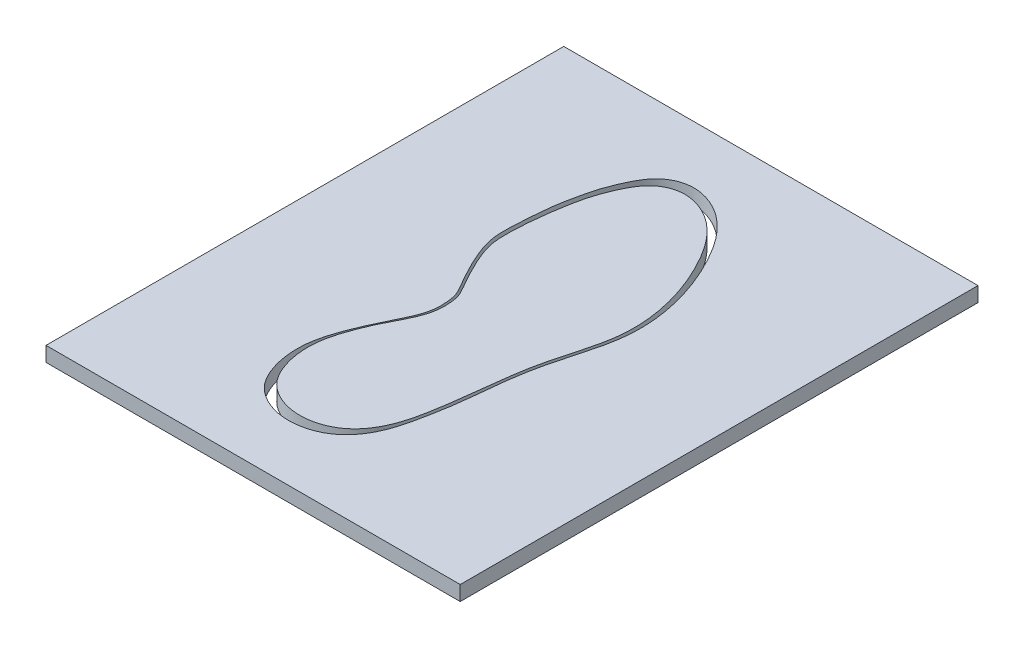
ISO-10303-21;
HEADER;
FILE_DESCRIPTION(('STEP AP214'),'2;1');
FILE_NAME('part.step','',(''),(''),'','','');
FILE_SCHEMA(('AUTOMOTIVE_DESIGN { 1 0 10303 214 1 1 1 1 }'));
ENDSEC;
DATA;
#1=APPLICATION_CONTEXT('core data for automotive mechanical design processes');
#2=APPLICATION_PROTOCOL_DEFINITION('international standard','automotive_design',2000,#1);
#3=PRODUCT_CONTEXT('',#1,'mechanical');
#4=PRODUCT('Part','Part','',(#3));
#5=PRODUCT_RELATED_PRODUCT_CATEGORY('part','',(#4));
#6=PRODUCT_DEFINITION_FORMATION('','',#4);
#7=PRODUCT_DEFINITION_CONTEXT('part definition',#1,'design');
#8=PRODUCT_DEFINITION('design','',#6,#7);
#9=PRODUCT_DEFINITION_SHAPE('','',#8);
#10=(LENGTH_UNIT() NAMED_UNIT(*) SI_UNIT(.MILLI.,.METRE.));
#11=(NAMED_UNIT(*) PLANE_ANGLE_UNIT() SI_UNIT($,.RADIAN.));
#12=(NAMED_UNIT(*) SI_UNIT($,.STERADIAN.) SOLID_ANGLE_UNIT());
#13=UNCERTAINTY_MEASURE_WITH_UNIT(LENGTH_MEASURE(1.E-05),#10,'distance_accuracy_value','');
#14=(GEOMETRIC_REPRESENTATION_CONTEXT(3) GLOBAL_UNCERTAINTY_ASSIGNED_CONTEXT((#13)) GLOBAL_UNIT_ASSIGNED_CONTEXT((#10,
#11,#12)) REPRESENTATION_CONTEXT('',''));
#15=CARTESIAN_POINT('',(0.,0.,0.));
#16=DIRECTION('',(0.,0.,1.));
#17=DIRECTION('',(1.,0.,0.));
#18=AXIS2_PLACEMENT_3D('',#15,#16,#17);
#19=CARTESIAN_POINT('',(39.071515045179,0.,-289.191713460955));
#20=CARTESIAN_POINT('',(36.7843321443078,0.,-289.043204994024));
#21=CARTESIAN_POINT('',(31.5349066885289,0.,-287.960394858502));
#22=CARTESIAN_POINT('',(24.0719898161011,0.,-283.508731667395));
#23=CARTESIAN_POINT('',(18.4391468612145,0.,-275.90311231066));
#24=CARTESIAN_POINT('',(13.8504328647284,0.,-266.260251260592));
#25=CARTESIAN_POINT('',(10.1872371657223,0.,-256.271347726682));
#26=CARTESIAN_POINT('',(6.90049589056789,0.,-241.474251783892));
#27=CARTESIAN_POINT('',(4.56900958336375,0.,-224.671633647286));
#28=CARTESIAN_POINT('',(3.42861613578065,0.,-208.175997234339));
#29=CARTESIAN_POINT('',(3.97866441496524,0.,-194.016708582578));
#30=CARTESIAN_POINT('',(9.64205838719882,0.,-178.657772381598));
#31=CARTESIAN_POINT('',(17.2469412435568,0.,-164.84194166683));
#32=CARTESIAN_POINT('',(23.6229019171972,0.,-154.038454970145));
#33=CARTESIAN_POINT('',(25.1235625136186,0.,-146.018566395798));
#34=CARTESIAN_POINT('',(25.009927703054,0.,-131.157514658181));
#35=CARTESIAN_POINT('',(14.6073943883956,0.,-114.232181052742));
#36=CARTESIAN_POINT('',(7.08436673653161,0.,-95.9110439805253));
#37=CARTESIAN_POINT('',(3.13024872423999,0.,-82.1231603648557));
#38=CARTESIAN_POINT('',(2.35479289544686,0.,-69.2444249654184));
#39=CARTESIAN_POINT('',(4.43721722500527,0.,-55.6607702504065));
#40=CARTESIAN_POINT('',(12.2838220761547,0.,-38.5155315548548));
#41=CARTESIAN_POINT('',(34.6662568830087,0.,-26.5559346371254));
#42=CARTESIAN_POINT('',(60.2142297148544,0.,-32.1959006756966));
#43=CARTESIAN_POINT('',(76.6316011839039,0.,-52.163311317483));
#44=CARTESIAN_POINT('',(83.3109457842583,0.,-80.8796227575248));
#45=CARTESIAN_POINT('',(86.2039403370988,0.,-111.444244557665));
#46=CARTESIAN_POINT('',(90.3178506663487,0.,-139.623714684678));
#47=CARTESIAN_POINT('',(96.5873098246737,0.,-161.627157242931));
#48=CARTESIAN_POINT('',(102.257255545625,0.,-183.725585081417));
#49=CARTESIAN_POINT('',(101.601282412399,0.,-206.397808239554));
#50=CARTESIAN_POINT('',(96.2803690372181,0.,-229.960784387677));
#51=CARTESIAN_POINT('',(86.1348331378277,0.,-253.326091062377));
#52=CARTESIAN_POINT('',(72.4897383753447,0.,-274.211185251201));
#53=CARTESIAN_POINT('',(56.1641016601698,0.,-286.501072373214));
#54=CARTESIAN_POINT('',(44.4282953642183,0.,-289.539533144535));
#55=CARTESIAN_POINT('',(39.071515045179,0.,-289.191713460955));
#56=B_SPLINE_CURVE_WITH_KNOTS('',3,(#19,#20,#21,#22,#23,#24,#25,#26,#27,#28,#29,#30,#31,#32,#33,
#34,#35,#36,#37,#38,#39,#40,#41,#42,#43,#44,#45,#46,#47,#48,#49,#50,#51,#52,#53,#54,#55),
.UNSPECIFIED.,.T.,.F.,(4,1,1,1,1,1,1,1,1,1,1,1,1,1,1,1,1,1,1,1,1,1,1,1,1,1,1,1,1,1,1,1,1,1,4),
(0.,0.0111973928464421,0.0258706031382565,0.0413531857021164,0.0567169066378104,
0.0780874352022051,0.0932062058377431,0.130762228213425,0.161070933899422,0.17402056249758,
0.199735750408866,0.239777949753785,0.25184944477469,0.260384496903719,0.279363991676444,
0.323052958360044,0.354374743132317,0.376673721816087,0.392737200335236,0.417093150879936,
0.443447683136685,0.481983768080878,0.531424972760055,0.557124983773916,0.604875647616145,
0.672152169532275,0.708490081323724,0.743678814588065,0.784132299014145,0.819354322185745,
0.853415036429794,0.901765614756082,0.943420331132581,0.97377473677268,1.),.UNSPECIFIED.);
#57=DIRECTION('',(0.,1.,0.));
#58=VECTOR('',#57,1.);
#59=SURFACE_OF_LINEAR_EXTRUSION('',#56,#58);
#60=CARTESIAN_POINT('',(39.071515045179,0.,-289.191713460955));
#61=VERTEX_POINT('',#60);
#62=EDGE_CURVE('E11',#61,#61,#56,.T.);
#63=ORIENTED_EDGE('',*,*,#62,.T.);
#64=EDGE_LOOP('',(#63));
#65=FACE_BOUND('',#64,.T.);
#66=CARTESIAN_POINT('',(39.071515045179,10.,-289.191713460955));
#67=CARTESIAN_POINT('',(36.7843321443078,10.,-289.043204994024));
#68=CARTESIAN_POINT('',(31.5349066885289,10.,-287.960394858502));
#69=CARTESIAN_POINT('',(24.0719898161011,10.,-283.508731667395));
#70=CARTESIAN_POINT('',(18.4391468612145,10.,-275.90311231066));
#71=CARTESIAN_POINT('',(13.8504328647284,10.,-266.260251260592));
#72=CARTESIAN_POINT('',(10.1872371657223,10.,-256.271347726682));
#73=CARTESIAN_POINT('',(6.90049589056789,10.,-241.474251783892));
#74=CARTESIAN_POINT('',(4.56900958336375,10.,-224.671633647286));
#75=CARTESIAN_POINT('',(3.42861613578065,10.,-208.175997234339));
#76=CARTESIAN_POINT('',(3.97866441496524,10.,-194.016708582578));
#77=CARTESIAN_POINT('',(9.64205838719882,10.,-178.657772381598));
#78=CARTESIAN_POINT('',(17.2469412435568,10.,-164.84194166683));
#79=CARTESIAN_POINT('',(23.6229019171972,10.,-154.038454970145));
#80=CARTESIAN_POINT('',(25.1235625136186,10.,-146.018566395798));
#81=CARTESIAN_POINT('',(25.009927703054,10.,-131.157514658181));
#82=CARTESIAN_POINT('',(14.6073943883956,10.,-114.232181052742));
#83=CARTESIAN_POINT('',(7.08436673653161,10.,-95.9110439805253));
#84=CARTESIAN_POINT('',(3.13024872423999,10.,-82.1231603648557));
#85=CARTESIAN_POINT('',(2.35479289544686,10.,-69.2444249654184));
#86=CARTESIAN_POINT('',(4.43721722500527,10.,-55.6607702504065));
#87=CARTESIAN_POINT('',(12.2838220761547,10.,-38.5155315548548));
#88=CARTESIAN_POINT('',(34.6662568830087,10.,-26.5559346371254));
#89=CARTESIAN_POINT('',(60.2142297148544,10.,-32.1959006756966));
#90=CARTESIAN_POINT('',(76.6316011839039,10.,-52.163311317483));
#91=CARTESIAN_POINT('',(83.3109457842583,10.,-80.8796227575248));
#92=CARTESIAN_POINT('',(86.2039403370988,10.,-111.444244557665));
#93=CARTESIAN_POINT('',(90.3178506663487,10.,-139.623714684678));
#94=CARTESIAN_POINT('',(96.5873098246737,10.,-161.627157242931));
#95=CARTESIAN_POINT('',(102.257255545625,10.,-183.725585081417));
#96=CARTESIAN_POINT('',(101.601282412399,10.,-206.397808239554));
#97=CARTESIAN_POINT('',(96.2803690372181,10.,-229.960784387677));
#98=CARTESIAN_POINT('',(86.1348331378277,10.,-253.326091062377));
#99=CARTESIAN_POINT('',(72.4897383753447,10.,-274.211185251201));
#100=CARTESIAN_POINT('',(56.1641016601698,10.,-286.501072373214));
#101=CARTESIAN_POINT('',(44.4282953642183,10.,-289.539533144535));
#102=CARTESIAN_POINT('',(39.071515045179,10.,-289.191713460955));
#103=B_SPLINE_CURVE_WITH_KNOTS('',3,(#66,#67,#68,#69,#70,#71,#72,#73,#74,#75,#76,#77,#78,#79,
#80,#81,#82,#83,#84,#85,#86,#87,#88,#89,#90,#91,#92,#93,#94,#95,#96,#97,#98,#99,#100,#101,#102),
.UNSPECIFIED.,.T.,.F.,(4,1,1,1,1,1,1,1,1,1,1,1,1,1,1,1,1,1,1,1,1,1,1,1,1,1,1,1,1,1,1,1,1,1,4),
(0.,0.0111973928464421,0.0258706031382565,0.0413531857021164,0.0567169066378104,
0.0780874352022051,0.0932062058377431,0.130762228213425,0.161070933899422,0.17402056249758,
0.199735750408866,0.239777949753785,0.25184944477469,0.260384496903719,0.279363991676444,
0.323052958360044,0.354374743132317,0.376673721816087,0.392737200335236,0.417093150879936,
0.443447683136685,0.481983768080878,0.531424972760055,0.557124983773916,0.604875647616145,
0.672152169532275,0.708490081323724,0.743678814588065,0.784132299014145,0.819354322185745,
0.853415036429794,0.901765614756082,0.943420331132581,0.97377473677268,1.),.UNSPECIFIED.);
#104=CARTESIAN_POINT('',(39.071515045179,10.,-289.191713460955));
#105=VERTEX_POINT('',#104);
#106=EDGE_CURVE('E51',#105,#105,#103,.T.);
#107=ORIENTED_EDGE('',*,*,#106,.F.);
#108=EDGE_LOOP('',(#107));
#109=FACE_BOUND('',#108,.T.);
#110=ADVANCED_FACE('F47',(#65,#109),#59,.T.);
#111=CARTESIAN_POINT('',(44.4256353184242,0.,-29.9743842931018));
#112=DIRECTION('',(0.,-1.,0.));
#113=DIRECTION('',(0.,0.,-1.));
#114=AXIS2_PLACEMENT_3D('',#111,#112,#113);
#115=PLANE('',#114);
#116=ORIENTED_EDGE('',*,*,#62,.F.);
#117=EDGE_LOOP('',(#116));
#118=FACE_BOUND('',#117,.T.);
#119=ADVANCED_FACE('F70',(#118),#115,.T.);
#120=CARTESIAN_POINT('',(44.4256353184242,10.,-29.9743842931018));
#121=DIRECTION('',(0.,-1.,0.));
#122=DIRECTION('',(0.,0.,-1.));
#123=AXIS2_PLACEMENT_3D('',#120,#121,#122);
#124=PLANE('',#123);
#125=ORIENTED_EDGE('',*,*,#106,.T.);
#126=EDGE_LOOP('',(#125));
#127=FACE_BOUND('',#126,.T.);
#128=ADVANCED_FACE('F67',(#127),#124,.F.);
#129=CLOSED_SHELL('',(#110,#119,#128));
#130=MANIFOLD_SOLID_BREP('B2',#129);
#131=CARTESIAN_POINT('',(0.,10.,0.));
#132=DIRECTION('',(0.,1.,0.));
#133=DIRECTION('',(0.,0.,1.));
#134=AXIS2_PLACEMENT_3D('',#131,#132,#133);
#135=PLANE('',#134);
#136=DIRECTION('',(0.,0.,-1.));
#137=VECTOR('',#136,1.);
#138=CARTESIAN_POINT('',(193.146720033463,10.,-334.885236331025));
#139=LINE('',#138,#137);
#140=CARTESIAN_POINT('',(193.146720033463,10.,15.1147636689745));
#141=VERTEX_POINT('',#140);
#142=CARTESIAN_POINT('',(193.146720033463,10.,-334.885236331025));
#143=VERTEX_POINT('',#142);
#144=EDGE_CURVE('E152',#141,#143,#139,.T.);
#145=ORIENTED_EDGE('',*,*,#144,.T.);
#146=DIRECTION('',(-1.,0.,0.));
#147=VECTOR('',#146,1.);
#148=CARTESIAN_POINT('',(-86.8532799665366,10.,-334.885236331025));
#149=LINE('',#148,#147);
#150=CARTESIAN_POINT('',(-86.8532799665366,10.,-334.885236331025));
#151=VERTEX_POINT('',#150);
#152=EDGE_CURVE('E147',#143,#151,#149,.T.);
#153=ORIENTED_EDGE('',*,*,#152,.T.);
#154=DIRECTION('',(0.,0.,1.));
#155=VECTOR('',#154,1.);
#156=CARTESIAN_POINT('',(-86.8532799665366,10.,-334.885236331025));
#157=LINE('',#156,#155);
#158=CARTESIAN_POINT('',(-86.8532799665365,10.,15.1147636689745));
#159=VERTEX_POINT('',#158);
#160=EDGE_CURVE('E150',#151,#159,#157,.T.);
#161=ORIENTED_EDGE('',*,*,#160,.T.);
#162=DIRECTION('',(1.,0.,0.));
#163=VECTOR('',#162,1.);
#164=CARTESIAN_POINT('',(-86.8532799665365,10.,15.1147636689745));
#165=LINE('',#164,#163);
#166=EDGE_CURVE('E117',#159,#141,#165,.T.);
#167=ORIENTED_EDGE('',*,*,#166,.T.);
#168=EDGE_LOOP('',(#145,#153,#161,#167));
#169=FACE_BOUND('',#168,.T.);
#170=CARTESIAN_POINT('',(38.2486009662926,10.,-296.026263032145));
#171=CARTESIAN_POINT('',(35.8410205924902,10.,-295.869941907046));
#172=CARTESIAN_POINT('',(30.3152313815846,10.,-294.730156234771));
#173=CARTESIAN_POINT('',(22.4601477911935,10.,-290.044080709402));
#174=CARTESIAN_POINT('',(16.5282771912409,10.,-282.038639036599));
#175=CARTESIAN_POINT('',(11.708875058567,10.,-271.886259135016));
#176=CARTESIAN_POINT('',(7.80280987634336,10.,-261.380875488947));
#177=CARTESIAN_POINT('',(5.70893879511554,10.,-251.324876791515));
#178=CARTESIAN_POINT('',(3.21656162403846,10.,-240.260346118907));
#179=CARTESIAN_POINT('',(1.9280146591478,10.,-225.673824984631));
#180=CARTESIAN_POINT('',(0.712749248467255,10.,-210.750871529598));
#181=CARTESIAN_POINT('',(1.3142305404296,10.,-195.83868816298));
#182=CARTESIAN_POINT('',(5.96769838523578,10.,-183.243218440255));
#183=CARTESIAN_POINT('',(12.2303211260877,10.,-170.569159559961));
#184=CARTESIAN_POINT('',(17.7961504206174,10.,-160.872882756807));
#185=CARTESIAN_POINT('',(21.9892840980305,10.,-153.758806103128));
#186=CARTESIAN_POINT('',(23.5553930131302,10.,-145.317228798112));
#187=CARTESIAN_POINT('',(23.5972904880834,10.,-134.395063888974));
#188=CARTESIAN_POINT('',(18.1548717569456,10.,-121.812338833649));
#189=CARTESIAN_POINT('',(10.8843763040772,10.,-107.467497450576));
#190=CARTESIAN_POINT('',(4.53517804609796,10.,-92.5688359301164));
#191=CARTESIAN_POINT('',(0.422338647292636,10.,-78.0599987777879));
#192=CARTESIAN_POINT('',(-0.403038286343288,10.,-64.5025753269025));
#193=CARTESIAN_POINT('',(1.79240564834084,10.,-50.2042520358633));
#194=CARTESIAN_POINT('',(10.0500128299186,10.,-32.1567770783732));
#195=CARTESIAN_POINT('',(33.6159146273364,10.,-19.5662098277966));
#196=CARTESIAN_POINT('',(60.4876102088907,10.,-25.5095472458203));
#197=CARTESIAN_POINT('',(77.825202179469,10.,-46.5101668136167));
#198=CARTESIAN_POINT('',(82.5493309073311,10.,-68.1315397054439));
#199=CARTESIAN_POINT('',(86.8882350982551,10.,-92.4141464573186));
#200=CARTESIAN_POINT('',(88.5385345226957,10.,-114.699319674578));
#201=CARTESIAN_POINT('',(92.2311519596202,10.,-138.573944477741));
#202=CARTESIAN_POINT('',(98.779440351739,10.,-161.751601998303));
#203=CARTESIAN_POINT('',(104.762851430152,10.,-185.008356542756));
#204=CARTESIAN_POINT('',(104.068701572802,10.,-208.875006986446));
#205=CARTESIAN_POINT('',(98.4687249378186,10.,-233.677829105638));
#206=CARTESIAN_POINT('',(87.7888593772341,10.,-258.272999950938));
#207=CARTESIAN_POINT('',(73.4257009150909,10.,-280.257280071678));
#208=CARTESIAN_POINT('',(56.2407703636522,10.,-293.19401459343));
#209=CARTESIAN_POINT('',(43.887362587839,10.,-296.392380637373));
#210=CARTESIAN_POINT('',(38.2486009662926,10.,-296.026263032145));
#211=B_SPLINE_CURVE_WITH_KNOTS('',3,(#170,#171,#172,#173,#174,#175,#176,#177,#178,#179,#180,
#181,#182,#183,#184,#185,#186,#187,#188,#189,#190,#191,#192,#193,#194,#195,#196,#197,#198,#199,
#200,#201,#202,#203,#204,#205,#206,#207,#208,#209,#210),.UNSPECIFIED.,.T.,.F.,(4,1,1,1,1,1,1,1,
1,1,1,1,1,1,1,1,1,1,1,1,1,1,1,1,1,1,1,1,1,1,1,1,1,1,1,1,1,1,4),(0.,0.0111973928464423,
0.025870603138263,0.0413531857021164,0.0567169066378108,0.0780874352022053,0.0932062058377435,
0.104403598684186,0.130762228213425,0.161070933899421,0.17402056249758,0.199735750408867,
0.222489748077789,0.239777949753785,0.251849444774688,0.260384496903713,0.279363991676444,
0.301614912160635,0.323052958360044,0.354374743132317,0.376673721816087,0.392737200335236,
0.417093150879936,0.443447683136685,0.481983768080875,0.531424972760055,0.557124983773916,
0.604875647616145,0.631667447392159,0.672152169532275,0.708490081323724,0.743678814588058,
0.784132299014145,0.819354322185746,0.853415036429794,0.901765614756082,0.94342033113258,
0.97377473677268,1.),.UNSPECIFIED.);
#212=CARTESIAN_POINT('',(38.2486009662926,10.,-296.026263032145));
#213=VERTEX_POINT('',#212);
#214=EDGE_CURVE('E172',#213,#213,#211,.T.);
#215=ORIENTED_EDGE('',*,*,#214,.F.);
#216=EDGE_LOOP('',(#215));
#217=FACE_BOUND('',#216,.T.);
#218=ADVANCED_FACE('F99',(#169,#217),#135,.T.);
#219=CARTESIAN_POINT('',(0.,0.,0.));
#220=DIRECTION('',(0.,1.,0.));
#221=DIRECTION('',(0.,0.,1.));
#222=AXIS2_PLACEMENT_3D('',#219,#220,#221);
#223=PLANE('',#222);
#224=DIRECTION('',(0.,0.,-1.));
#225=VECTOR('',#224,1.);
#226=CARTESIAN_POINT('',(193.146720033463,0.,-334.885236331025));
#227=LINE('',#226,#225);
#228=CARTESIAN_POINT('',(193.146720033463,0.,15.1147636689745));
#229=VERTEX_POINT('',#228);
#230=CARTESIAN_POINT('',(193.146720033463,0.,-334.885236331025));
#231=VERTEX_POINT('',#230);
#232=EDGE_CURVE('E168',#229,#231,#227,.T.);
#233=ORIENTED_EDGE('',*,*,#232,.F.);
#234=DIRECTION('',(1.,0.,0.));
#235=VECTOR('',#234,1.);
#236=CARTESIAN_POINT('',(-86.8532799665365,0.,15.1147636689745));
#237=LINE('',#236,#235);
#238=CARTESIAN_POINT('',(-86.8532799665365,0.,15.1147636689745));
#239=VERTEX_POINT('',#238);
#240=EDGE_CURVE('E140',#239,#229,#237,.T.);
#241=ORIENTED_EDGE('',*,*,#240,.F.);
#242=DIRECTION('',(0.,0.,1.));
#243=VECTOR('',#242,1.);
#244=CARTESIAN_POINT('',(-86.8532799665366,0.,-334.885236331025));
#245=LINE('',#244,#243);
#246=CARTESIAN_POINT('',(-86.8532799665366,0.,-334.885236331025));
#247=VERTEX_POINT('',#246);
#248=EDGE_CURVE('E134',#247,#239,#245,.T.);
#249=ORIENTED_EDGE('',*,*,#248,.F.);
#250=DIRECTION('',(-1.,0.,0.));
#251=VECTOR('',#250,1.);
#252=CARTESIAN_POINT('',(-86.8532799665366,0.,-334.885236331025));
#253=LINE('',#252,#251);
#254=EDGE_CURVE('E157',#231,#247,#253,.T.);
#255=ORIENTED_EDGE('',*,*,#254,.F.);
#256=EDGE_LOOP('',(#233,#241,#249,#255));
#257=FACE_BOUND('',#256,.T.);
#258=CARTESIAN_POINT('',(38.2486009662926,0.,-296.026263032145));
#259=CARTESIAN_POINT('',(35.8410205924902,0.,-295.869941907046));
#260=CARTESIAN_POINT('',(30.3152313815846,0.,-294.730156234771));
#261=CARTESIAN_POINT('',(22.4601477911935,0.,-290.044080709402));
#262=CARTESIAN_POINT('',(16.5282771912409,0.,-282.038639036599));
#263=CARTESIAN_POINT('',(11.708875058567,0.,-271.886259135016));
#264=CARTESIAN_POINT('',(7.80280987634336,0.,-261.380875488947));
#265=CARTESIAN_POINT('',(5.70893879511554,0.,-251.324876791515));
#266=CARTESIAN_POINT('',(3.21656162403846,0.,-240.260346118907));
#267=CARTESIAN_POINT('',(1.9280146591478,0.,-225.673824984631));
#268=CARTESIAN_POINT('',(0.712749248467255,0.,-210.750871529598));
#269=CARTESIAN_POINT('',(1.3142305404296,0.,-195.83868816298));
#270=CARTESIAN_POINT('',(5.96769838523578,0.,-183.243218440255));
#271=CARTESIAN_POINT('',(12.2303211260877,0.,-170.569159559961));
#272=CARTESIAN_POINT('',(17.7961504206174,0.,-160.872882756807));
#273=CARTESIAN_POINT('',(21.9892840980305,0.,-153.758806103128));
#274=CARTESIAN_POINT('',(23.5553930131302,0.,-145.317228798112));
#275=CARTESIAN_POINT('',(23.5972904880834,0.,-134.395063888974));
#276=CARTESIAN_POINT('',(18.1548717569456,0.,-121.812338833649));
#277=CARTESIAN_POINT('',(10.8843763040772,0.,-107.467497450576));
#278=CARTESIAN_POINT('',(4.53517804609796,0.,-92.5688359301164));
#279=CARTESIAN_POINT('',(0.422338647292636,0.,-78.0599987777879));
#280=CARTESIAN_POINT('',(-0.403038286343288,0.,-64.5025753269025));
#281=CARTESIAN_POINT('',(1.79240564834084,0.,-50.2042520358633));
#282=CARTESIAN_POINT('',(10.0500128299186,0.,-32.1567770783732));
#283=CARTESIAN_POINT('',(33.6159146273364,0.,-19.5662098277966));
#284=CARTESIAN_POINT('',(60.4876102088907,0.,-25.5095472458203));
#285=CARTESIAN_POINT('',(77.825202179469,0.,-46.5101668136167));
#286=CARTESIAN_POINT('',(82.5493309073311,0.,-68.1315397054439));
#287=CARTESIAN_POINT('',(86.8882350982551,0.,-92.4141464573186));
#288=CARTESIAN_POINT('',(88.5385345226957,0.,-114.699319674578));
#289=CARTESIAN_POINT('',(92.2311519596202,0.,-138.573944477741));
#290=CARTESIAN_POINT('',(98.779440351739,0.,-161.751601998303));
#291=CARTESIAN_POINT('',(104.762851430152,0.,-185.008356542756));
#292=CARTESIAN_POINT('',(104.068701572802,0.,-208.875006986446));
#293=CARTESIAN_POINT('',(98.4687249378186,0.,-233.677829105638));
#294=CARTESIAN_POINT('',(87.7888593772341,0.,-258.272999950938));
#295=CARTESIAN_POINT('',(73.4257009150909,0.,-280.257280071678));
#296=CARTESIAN_POINT('',(56.2407703636522,0.,-293.19401459343));
#297=CARTESIAN_POINT('',(43.887362587839,0.,-296.392380637373));
#298=CARTESIAN_POINT('',(38.2486009662926,0.,-296.026263032145));
#299=B_SPLINE_CURVE_WITH_KNOTS('',3,(#258,#259,#260,#261,#262,#263,#264,#265,#266,#267,#268,
#269,#270,#271,#272,#273,#274,#275,#276,#277,#278,#279,#280,#281,#282,#283,#284,#285,#286,#287,
#288,#289,#290,#291,#292,#293,#294,#295,#296,#297,#298),.UNSPECIFIED.,.T.,.F.,(4,1,1,1,1,1,1,1,
1,1,1,1,1,1,1,1,1,1,1,1,1,1,1,1,1,1,1,1,1,1,1,1,1,1,1,1,1,1,4),(0.,0.0111973928464423,
0.025870603138263,0.0413531857021164,0.0567169066378108,0.0780874352022053,0.0932062058377435,
0.104403598684186,0.130762228213425,0.161070933899421,0.17402056249758,0.199735750408867,
0.222489748077789,0.239777949753785,0.251849444774688,0.260384496903713,0.279363991676444,
0.301614912160635,0.323052958360044,0.354374743132317,0.376673721816087,0.392737200335236,
0.417093150879936,0.443447683136685,0.481983768080875,0.531424972760055,0.557124983773916,
0.604875647616145,0.631667447392159,0.672152169532275,0.708490081323724,0.743678814588058,
0.784132299014145,0.819354322185746,0.853415036429794,0.901765614756082,0.94342033113258,
0.97377473677268,1.),.UNSPECIFIED.);
#300=CARTESIAN_POINT('',(38.2486009662926,0.,-296.026263032145));
#301=VERTEX_POINT('',#300);
#302=EDGE_CURVE('E190',#301,#301,#299,.T.);
#303=ORIENTED_EDGE('',*,*,#302,.T.);
#304=EDGE_LOOP('',(#303));
#305=FACE_BOUND('',#304,.T.);
#306=ADVANCED_FACE('F185',(#257,#305),#223,.F.);
#307=CARTESIAN_POINT('',(193.146720033463,10.,-334.885236331025));
#308=DIRECTION('',(-1.,0.,0.));
#309=DIRECTION('',(0.,0.,1.));
#310=AXIS2_PLACEMENT_3D('',#307,#308,#309);
#311=PLANE('',#310);
#312=ORIENTED_EDGE('',*,*,#232,.T.);
#313=DIRECTION('',(0.,-1.,0.));
#314=VECTOR('',#313,1.);
#315=CARTESIAN_POINT('',(193.146720033463,10.,-334.885236331025));
#316=LINE('',#315,#314);
#317=EDGE_CURVE('E45',#143,#231,#316,.T.);
#318=ORIENTED_EDGE('',*,*,#317,.F.);
#319=ORIENTED_EDGE('',*,*,#144,.F.);
#320=DIRECTION('',(0.,-1.,0.));
#321=VECTOR('',#320,1.);
#322=CARTESIAN_POINT('',(193.146720033463,10.,15.1147636689745));
#323=LINE('',#322,#321);
#324=EDGE_CURVE('E164',#141,#229,#323,.T.);
#325=ORIENTED_EDGE('',*,*,#324,.T.);
#326=EDGE_LOOP('',(#312,#318,#319,#325));
#327=FACE_BOUND('',#326,.T.);
#328=ADVANCED_FACE('F101',(#327),#311,.F.);
#329=CARTESIAN_POINT('',(-86.8532799665366,10.,-334.885236331025));
#330=DIRECTION('',(0.,0.,1.));
#331=DIRECTION('',(1.,0.,0.));
#332=AXIS2_PLACEMENT_3D('',#329,#330,#331);
#333=PLANE('',#332);
#334=ORIENTED_EDGE('',*,*,#254,.T.);
#335=DIRECTION('',(0.,-1.,0.));
#336=VECTOR('',#335,1.);
#337=CARTESIAN_POINT('',(-86.8532799665366,10.,-334.885236331025));
#338=LINE('',#337,#336);
#339=EDGE_CURVE('E109',#151,#247,#338,.T.);
#340=ORIENTED_EDGE('',*,*,#339,.F.);
#341=ORIENTED_EDGE('',*,*,#152,.F.);
#342=ORIENTED_EDGE('',*,*,#317,.T.);
#343=EDGE_LOOP('',(#334,#340,#341,#342));
#344=FACE_BOUND('',#343,.T.);
#345=ADVANCED_FACE('F156',(#344),#333,.F.);
#346=CARTESIAN_POINT('',(-86.8532799665366,10.,-334.885236331025));
#347=DIRECTION('',(1.,0.,0.));
#348=DIRECTION('',(0.,0.,-1.));
#349=AXIS2_PLACEMENT_3D('',#346,#347,#348);
#350=PLANE('',#349);
#351=ORIENTED_EDGE('',*,*,#248,.T.);
#352=DIRECTION('',(0.,-1.,0.));
#353=VECTOR('',#352,1.);
#354=CARTESIAN_POINT('',(-86.8532799665365,10.,15.1147636689745));
#355=LINE('',#354,#353);
#356=EDGE_CURVE('E159',#159,#239,#355,.T.);
#357=ORIENTED_EDGE('',*,*,#356,.F.);
#358=ORIENTED_EDGE('',*,*,#160,.F.);
#359=ORIENTED_EDGE('',*,*,#339,.T.);
#360=EDGE_LOOP('',(#351,#357,#358,#359));
#361=FACE_BOUND('',#360,.T.);
#362=ADVANCED_FACE('F160',(#361),#350,.F.);
#363=CARTESIAN_POINT('',(-86.8532799665365,10.,15.1147636689745));
#364=DIRECTION('',(0.,0.,-1.));
#365=DIRECTION('',(-1.,0.,0.));
#366=AXIS2_PLACEMENT_3D('',#363,#364,#365);
#367=PLANE('',#366);
#368=ORIENTED_EDGE('',*,*,#240,.T.);
#369=ORIENTED_EDGE('',*,*,#324,.F.);
#370=ORIENTED_EDGE('',*,*,#166,.F.);
#371=ORIENTED_EDGE('',*,*,#356,.T.);
#372=EDGE_LOOP('',(#368,#369,#370,#371));
#373=FACE_BOUND('',#372,.T.);
#374=ADVANCED_FACE('F182',(#373),#367,.F.);
#375=DIRECTION('',(0.,-1.,0.));
#376=VECTOR('',#375,1.);
#377=SURFACE_OF_LINEAR_EXTRUSION('',#211,#376);
#378=ORIENTED_EDGE('',*,*,#214,.T.);
#379=EDGE_LOOP('',(#378));
#380=FACE_BOUND('',#379,.T.);
#381=ORIENTED_EDGE('',*,*,#302,.F.);
#382=EDGE_LOOP('',(#381));
#383=FACE_BOUND('',#382,.T.);
#384=ADVANCED_FACE('F208',(#380,#383),#377,.T.);
#385=CLOSED_SHELL('',(#218,#306,#328,#345,#362,#374,#384));
#386=MANIFOLD_SOLID_BREP('B6',#385);
#387=ADVANCED_BREP_SHAPE_REPRESENTATION('',(#18,#130,#386),#14);
#388=SHAPE_DEFINITION_REPRESENTATION(#9,#387);
ENDSEC;
END-ISO-10303-21;
